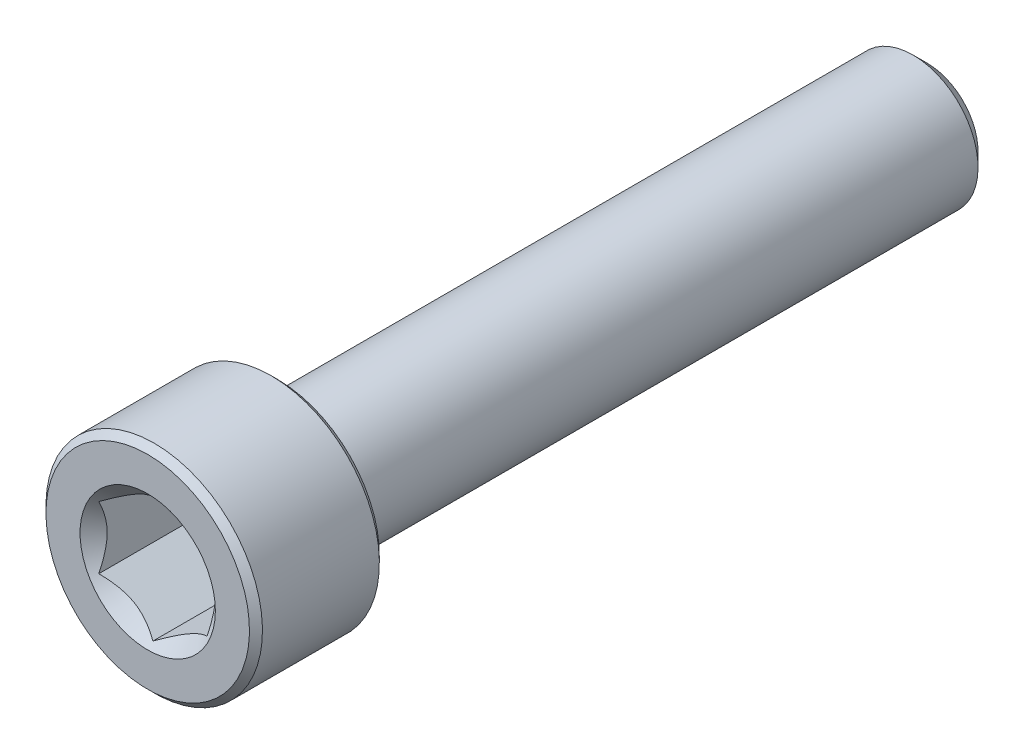
ISO-10303-21;
HEADER;
FILE_DESCRIPTION(('STEP AP214'),'2;1');
FILE_NAME('part.step','',(''),(''),'','','');
FILE_SCHEMA(('AUTOMOTIVE_DESIGN { 1 0 10303 214 1 1 1 1 }'));
ENDSEC;
DATA;
#1=APPLICATION_CONTEXT('core data for automotive mechanical design processes');
#2=APPLICATION_PROTOCOL_DEFINITION('international standard','automotive_design',2000,#1);
#3=PRODUCT_CONTEXT('',#1,'mechanical');
#4=PRODUCT('Part','Part','',(#3));
#5=PRODUCT_RELATED_PRODUCT_CATEGORY('part','',(#4));
#6=PRODUCT_DEFINITION_FORMATION('','',#4);
#7=PRODUCT_DEFINITION_CONTEXT('part definition',#1,'design');
#8=PRODUCT_DEFINITION('design','',#6,#7);
#9=PRODUCT_DEFINITION_SHAPE('','',#8);
#10=(LENGTH_UNIT() NAMED_UNIT(*) SI_UNIT(.MILLI.,.METRE.));
#11=(NAMED_UNIT(*) PLANE_ANGLE_UNIT() SI_UNIT($,.RADIAN.));
#12=(NAMED_UNIT(*) SI_UNIT($,.STERADIAN.) SOLID_ANGLE_UNIT());
#13=UNCERTAINTY_MEASURE_WITH_UNIT(LENGTH_MEASURE(1.E-05),#10,'distance_accuracy_value','');
#14=(GEOMETRIC_REPRESENTATION_CONTEXT(3) GLOBAL_UNCERTAINTY_ASSIGNED_CONTEXT((#13)) GLOBAL_UNIT_ASSIGNED_CONTEXT((#10,
#11,#12)) REPRESENTATION_CONTEXT('',''));
#15=CARTESIAN_POINT('',(0.,0.,0.));
#16=DIRECTION('',(0.,0.,1.));
#17=DIRECTION('',(1.,0.,0.));
#18=AXIS2_PLACEMENT_3D('',#15,#16,#17);
#19=CARTESIAN_POINT('',(0.,2.35048094716167,-18.));
#20=DIRECTION('',(0.,0.,-1.));
#21=DIRECTION('',(0.,1.,0.));
#22=AXIS2_PLACEMENT_3D('',#19,#20,#21);
#23=PLANE('',#22);
#24=CARTESIAN_POINT('',(0.,0.,-18.));
#25=DIRECTION('',(0.,0.,-1.));
#26=DIRECTION('',(0.,1.,0.));
#27=AXIS2_PLACEMENT_3D('',#24,#25,#26);
#28=CIRCLE('',#27,2.35048094716167);
#29=CARTESIAN_POINT('',(0.,2.35048094716167,-18.));
#30=VERTEX_POINT('',#29);
#31=EDGE_CURVE('E54',#30,#30,#28,.T.);
#32=ORIENTED_EDGE('',*,*,#31,.T.);
#33=EDGE_LOOP('',(#32));
#34=FACE_BOUND('',#33,.T.);
#35=ADVANCED_FACE('F41',(#34),#23,.T.);
#36=CARTESIAN_POINT('',(0.,0.,-18.));
#37=DIRECTION('',(0.,0.,1.));
#38=DIRECTION('',(0.,-1.,0.));
#39=AXIS2_PLACEMENT_3D('',#36,#37,#38);
#40=CONICAL_SURFACE('',#39,2.35048094716167,0.785398163397446);
#41=CARTESIAN_POINT('',(0.,0.,-17.3504809471617));
#42=DIRECTION('',(0.,0.,-1.));
#43=DIRECTION('',(0.,1.,0.));
#44=AXIS2_PLACEMENT_3D('',#41,#42,#43);
#45=CIRCLE('',#44,3.);
#46=CARTESIAN_POINT('',(0.,3.,-17.3504809471617));
#47=VERTEX_POINT('',#46);
#48=EDGE_CURVE('E157',#47,#47,#45,.T.);
#49=ORIENTED_EDGE('',*,*,#48,.T.);
#50=EDGE_LOOP('',(#49));
#51=FACE_BOUND('',#50,.T.);
#52=ORIENTED_EDGE('',*,*,#31,.F.);
#53=EDGE_LOOP('',(#52));
#54=FACE_BOUND('',#53,.T.);
#55=ADVANCED_FACE('F163',(#51,#54),#40,.T.);
#56=CARTESIAN_POINT('',(0.,0.,-18.));
#57=DIRECTION('',(0.,0.,-1.));
#58=DIRECTION('',(0.,1.,0.));
#59=AXIS2_PLACEMENT_3D('',#56,#57,#58);
#60=CYLINDRICAL_SURFACE('',#59,3.);
#61=CARTESIAN_POINT('',(0.,0.,11.7));
#62=DIRECTION('',(0.,0.,-1.));
#63=DIRECTION('',(0.,1.,0.));
#64=AXIS2_PLACEMENT_3D('',#61,#62,#63);
#65=CIRCLE('',#64,3.);
#66=CARTESIAN_POINT('',(0.,3.,11.7));
#67=VERTEX_POINT('',#66);
#68=EDGE_CURVE('E154',#67,#67,#65,.T.);
#69=ORIENTED_EDGE('',*,*,#68,.T.);
#70=EDGE_LOOP('',(#69));
#71=FACE_BOUND('',#70,.T.);
#72=ORIENTED_EDGE('',*,*,#48,.F.);
#73=EDGE_LOOP('',(#72));
#74=FACE_BOUND('',#73,.T.);
#75=ADVANCED_FACE('F165',(#71,#74),#60,.T.);
#76=CARTESIAN_POINT('',(0.,0.,11.7));
#77=DIRECTION('',(0.,0.,-1.));
#78=DIRECTION('',(0.,1.,0.));
#79=AXIS2_PLACEMENT_3D('',#76,#77,#78);
#80=TOROIDAL_SURFACE('',#79,3.3,0.3);
#81=CARTESIAN_POINT('',(0.,0.,12.));
#82=DIRECTION('',(0.,0.,-1.));
#83=DIRECTION('',(0.,1.,0.));
#84=AXIS2_PLACEMENT_3D('',#81,#82,#83);
#85=CIRCLE('',#84,3.3);
#86=CARTESIAN_POINT('',(0.,3.3,12.));
#87=VERTEX_POINT('',#86);
#88=EDGE_CURVE('E151',#87,#87,#85,.T.);
#89=ORIENTED_EDGE('',*,*,#88,.T.);
#90=EDGE_LOOP('',(#89));
#91=FACE_BOUND('',#90,.T.);
#92=ORIENTED_EDGE('',*,*,#68,.F.);
#93=EDGE_LOOP('',(#92));
#94=FACE_BOUND('',#93,.T.);
#95=ADVANCED_FACE('F171',(#91,#94),#80,.F.);
#96=CARTESIAN_POINT('',(0.,4.7,12.));
#97=DIRECTION('',(0.,0.,-1.));
#98=DIRECTION('',(0.,1.,0.));
#99=AXIS2_PLACEMENT_3D('',#96,#97,#98);
#100=PLANE('',#99);
#101=CARTESIAN_POINT('',(0.,0.,12.));
#102=DIRECTION('',(0.,0.,-1.));
#103=DIRECTION('',(0.,1.,0.));
#104=AXIS2_PLACEMENT_3D('',#101,#102,#103);
#105=CIRCLE('',#104,4.7);
#106=CARTESIAN_POINT('',(0.,4.7,12.));
#107=VERTEX_POINT('',#106);
#108=EDGE_CURVE('E148',#107,#107,#105,.T.);
#109=ORIENTED_EDGE('',*,*,#108,.T.);
#110=EDGE_LOOP('',(#109));
#111=FACE_BOUND('',#110,.T.);
#112=ORIENTED_EDGE('',*,*,#88,.F.);
#113=EDGE_LOOP('',(#112));
#114=FACE_BOUND('',#113,.T.);
#115=ADVANCED_FACE('F177',(#111,#114),#100,.T.);
#116=CARTESIAN_POINT('',(0.,0.,12.));
#117=DIRECTION('',(0.,0.,1.));
#118=DIRECTION('',(0.,-1.,0.));
#119=AXIS2_PLACEMENT_3D('',#116,#117,#118);
#120=CONICAL_SURFACE('',#119,4.7,0.785398163397445);
#121=CARTESIAN_POINT('',(0.,0.,12.3));
#122=DIRECTION('',(0.,0.,-1.));
#123=DIRECTION('',(0.,1.,0.));
#124=AXIS2_PLACEMENT_3D('',#121,#122,#123);
#125=CIRCLE('',#124,5.);
#126=CARTESIAN_POINT('',(0.,5.,12.3));
#127=VERTEX_POINT('',#126);
#128=EDGE_CURVE('E145',#127,#127,#125,.T.);
#129=ORIENTED_EDGE('',*,*,#128,.T.);
#130=EDGE_LOOP('',(#129));
#131=FACE_BOUND('',#130,.T.);
#132=ORIENTED_EDGE('',*,*,#108,.F.);
#133=EDGE_LOOP('',(#132));
#134=FACE_BOUND('',#133,.T.);
#135=ADVANCED_FACE('F181',(#131,#134),#120,.T.);
#136=CARTESIAN_POINT('',(0.,0.,-18.));
#137=DIRECTION('',(0.,0.,-1.));
#138=DIRECTION('',(0.,1.,0.));
#139=AXIS2_PLACEMENT_3D('',#136,#137,#138);
#140=CYLINDRICAL_SURFACE('',#139,5.);
#141=CARTESIAN_POINT('',(0.,0.,17.7));
#142=DIRECTION('',(0.,0.,-1.));
#143=DIRECTION('',(0.,1.,0.));
#144=AXIS2_PLACEMENT_3D('',#141,#142,#143);
#145=CIRCLE('',#144,5.);
#146=CARTESIAN_POINT('',(0.,5.,17.7));
#147=VERTEX_POINT('',#146);
#148=EDGE_CURVE('E142',#147,#147,#145,.T.);
#149=ORIENTED_EDGE('',*,*,#148,.T.);
#150=EDGE_LOOP('',(#149));
#151=FACE_BOUND('',#150,.T.);
#152=ORIENTED_EDGE('',*,*,#128,.F.);
#153=EDGE_LOOP('',(#152));
#154=FACE_BOUND('',#153,.T.);
#155=ADVANCED_FACE('F185',(#151,#154),#140,.T.);
#156=CARTESIAN_POINT('',(0.,0.,17.7));
#157=DIRECTION('',(0.,0.,-1.));
#158=DIRECTION('',(0.,1.,0.));
#159=AXIS2_PLACEMENT_3D('',#156,#157,#158);
#160=CONICAL_SURFACE('',#159,5.,0.785398163397445);
#161=CARTESIAN_POINT('',(0.,0.,18.));
#162=DIRECTION('',(0.,0.,-1.));
#163=DIRECTION('',(0.,1.,0.));
#164=AXIS2_PLACEMENT_3D('',#161,#162,#163);
#165=CIRCLE('',#164,4.7);
#166=CARTESIAN_POINT('',(0.,4.7,18.));
#167=VERTEX_POINT('',#166);
#168=EDGE_CURVE('E139',#167,#167,#165,.T.);
#169=ORIENTED_EDGE('',*,*,#168,.T.);
#170=EDGE_LOOP('',(#169));
#171=FACE_BOUND('',#170,.T.);
#172=ORIENTED_EDGE('',*,*,#148,.F.);
#173=EDGE_LOOP('',(#172));
#174=FACE_BOUND('',#173,.T.);
#175=ADVANCED_FACE('F189',(#171,#174),#160,.T.);
#176=CARTESIAN_POINT('',(0.,0.,18.));
#177=DIRECTION('',(0.,0.,1.));
#178=DIRECTION('',(0.,-1.,0.));
#179=AXIS2_PLACEMENT_3D('',#176,#177,#178);
#180=PLANE('',#179);
#181=CARTESIAN_POINT('',(0.,0.,18.));
#182=DIRECTION('',(0.,0.,1.));
#183=DIRECTION('',(1.,0.,0.));
#184=AXIS2_PLACEMENT_3D('',#181,#182,#183);
#185=CIRCLE('',#184,3.125);
#186=CARTESIAN_POINT('',(3.125,0.,18.));
#187=VERTEX_POINT('',#186);
#188=EDGE_CURVE('E113',#187,#187,#185,.T.);
#189=ORIENTED_EDGE('',*,*,#188,.F.);
#190=EDGE_LOOP('',(#189));
#191=FACE_BOUND('',#190,.T.);
#192=ORIENTED_EDGE('',*,*,#168,.F.);
#193=EDGE_LOOP('',(#192));
#194=FACE_BOUND('',#193,.T.);
#195=ADVANCED_FACE('F193',(#191,#194),#180,.T.);
#196=CARTESIAN_POINT('',(0.,0.,18.));
#197=DIRECTION('',(0.,0.,1.));
#198=DIRECTION('',(1.,0.,0.));
#199=AXIS2_PLACEMENT_3D('',#196,#197,#198);
#200=CONICAL_SURFACE('',#199,3.125,0.78539816339745);
#201=ORIENTED_EDGE('',*,*,#188,.T.);
#202=EDGE_LOOP('',(#201));
#203=FACE_BOUND('',#202,.T.);
#204=CARTESIAN_POINT('',(-0.000200000000000056,-2.88686681600197,17.7618668229299));
#205=CARTESIAN_POINT('',(0.0857382777877643,-2.83725032818751,17.7122920513029));
#206=CARTESIAN_POINT('',(0.173113567275752,-2.7868041812811,17.6656288273106));
#207=CARTESIAN_POINT('',(0.351281456165588,-2.6839389026696,17.5801894859864));
#208=CARTESIAN_POINT('',(0.442091000681074,-2.6315099876986,17.5414609083541));
#209=CARTESIAN_POINT('',(0.625204123126921,-2.52578957716234,17.4751180498459));
#210=CARTESIAN_POINT('',(0.71746106452934,-2.47252500720904,17.447337014479));
#211=CARTESIAN_POINT('',(0.904006008776285,-2.3648232334321,17.4045345218588));
#212=CARTESIAN_POINT('',(0.998288312566283,-2.31038931995913,17.3894811126195));
#213=CARTESIAN_POINT('',(1.16077825829185,-2.21657570605387,17.3758990681576));
#214=CARTESIAN_POINT('',(1.22877596788015,-2.17731721011878,17.3738884451889));
#215=CARTESIAN_POINT('',(1.36466024116922,-2.0988643883567,17.3772754631356));
#216=CARTESIAN_POINT('',(1.43254675755224,-2.05967008984862,17.382675701248));
#217=CARTESIAN_POINT('',(1.56767878823611,-1.98165157555715,17.4005771343506));
#218=CARTESIAN_POINT('',(1.63492349975356,-1.94282782326097,17.4130862729946));
#219=CARTESIAN_POINT('',(1.7682501008182,-1.86585167424616,17.4445188479038));
#220=CARTESIAN_POINT('',(1.83433207909966,-1.82769922629678,17.4634417924449));
#221=CARTESIAN_POINT('',(2.00359634669126,-1.72997445583858,17.5196187073564));
#222=CARTESIAN_POINT('',(2.10572912222289,-1.67100807039231,17.5611071775443));
#223=CARTESIAN_POINT('',(2.25590641494051,-1.58430317001562,17.6311453926712));
#224=CARTESIAN_POINT('',(2.30539653988261,-1.55573003305807,17.6557535980642));
#225=CARTESIAN_POINT('',(2.40346006383885,-1.49911303110426,17.7072132326634));
#226=CARTESIAN_POINT('',(2.45203400349693,-1.47106885396706,17.7340632847275));
#227=CARTESIAN_POINT('',(2.5002,-1.44326020292023,17.7618668229299));
#228=B_SPLINE_CURVE_WITH_KNOTS('',3,(#204,#205,#206,#207,#208,#209,#210,#211,#212,#213,#214,
#215,#216,#217,#218,#219,#220,#221,#222,#223,#224,#225,#226,#227),.UNSPECIFIED.,.F.,.F.,(4,2,2,
2,2,2,2,2,2,2,2,4),(0.,0.333012085133922,0.667964518301396,0.997597032043299,1.32639954393844,
1.56169424147169,1.79707142102083,2.03271213522171,2.26833478775651,2.64260240809533,
2.82922877818863,3.01574133749025),.UNSPECIFIED.);
#229=CARTESIAN_POINT('',(0.,-2.88675134594813,17.7617513459481));
#230=VERTEX_POINT('',#229);
#231=CARTESIAN_POINT('',(2.5,-1.44337567297406,17.7617513459481));
#232=VERTEX_POINT('',#231);
#233=EDGE_CURVE('E12',#230,#232,#228,.T.);
#234=ORIENTED_EDGE('',*,*,#233,.F.);
#235=CARTESIAN_POINT('',(-2.5002,-1.44326020292023,17.7618668229299));
#236=CARTESIAN_POINT('',(-2.41426172221224,-1.49287669073469,17.7122920513029));
#237=CARTESIAN_POINT('',(-2.32688643272425,-1.5433228376411,17.6656288273106));
#238=CARTESIAN_POINT('',(-2.14871854383441,-1.64618811625259,17.5801894859864));
#239=CARTESIAN_POINT('',(-2.05790899931892,-1.69861703122359,17.5414609083541));
#240=CARTESIAN_POINT('',(-1.87479587687308,-1.80433744175986,17.4751180498459));
#241=CARTESIAN_POINT('',(-1.78253893547066,-1.85760201171316,17.447337014479));
#242=CARTESIAN_POINT('',(-1.59599399122371,-1.96530378549009,17.4045345218588));
#243=CARTESIAN_POINT('',(-1.50171168743371,-2.01973769896307,17.3894811126195));
#244=CARTESIAN_POINT('',(-1.33922174170815,-2.11355131286833,17.3758990681576));
#245=CARTESIAN_POINT('',(-1.27122403211985,-2.15280980880341,17.3738884451889));
#246=CARTESIAN_POINT('',(-1.13533975883078,-2.23126263056549,17.3772754631356));
#247=CARTESIAN_POINT('',(-1.06745324244776,-2.27045692907358,17.382675701248));
#248=CARTESIAN_POINT('',(-0.932321211763891,-2.34847544336505,17.4005771343506));
#249=CARTESIAN_POINT('',(-0.865076500246436,-2.38729919566123,17.4130862729946));
#250=CARTESIAN_POINT('',(-0.731749899181798,-2.46427534467604,17.4445188479038));
#251=CARTESIAN_POINT('',(-0.665667920900339,-2.50242779262542,17.4634417924449));
#252=CARTESIAN_POINT('',(-0.496403653308733,-2.60015256308362,17.5196187073564));
#253=CARTESIAN_POINT('',(-0.394270877777106,-2.65911894852989,17.5611071775443));
#254=CARTESIAN_POINT('',(-0.244093585059491,-2.74582384890657,17.6311453926712));
#255=CARTESIAN_POINT('',(-0.19460346011739,-2.77439698586412,17.6557535980642));
#256=CARTESIAN_POINT('',(-0.0965399361611533,-2.83101398781794,17.7072132326634));
#257=CARTESIAN_POINT('',(-0.0479659965030722,-2.85905816495513,17.7340632847275));
#258=CARTESIAN_POINT('',(0.000199999999999496,-2.88686681600197,17.7618668229299));
#259=B_SPLINE_CURVE_WITH_KNOTS('',3,(#235,#236,#237,#238,#239,#240,#241,#242,#243,#244,#245,
#246,#247,#248,#249,#250,#251,#252,#253,#254,#255,#256,#257,#258),.UNSPECIFIED.,.F.,.F.,(4,2,2,
2,2,2,2,2,2,2,2,4),(0.,0.333012085133923,0.667964518301397,0.997597032043301,1.32639954393844,
1.56169424147169,1.79707142102083,2.03271213522171,2.26833478775651,2.64260240809533,
2.82922877818864,3.01574133749025),.UNSPECIFIED.);
#260=CARTESIAN_POINT('',(-2.5,-1.44337567297406,17.7617513459481));
#261=VERTEX_POINT('',#260);
#262=EDGE_CURVE('E99',#261,#230,#259,.T.);
#263=ORIENTED_EDGE('',*,*,#262,.F.);
#264=CARTESIAN_POINT('',(-2.5,-3.05811902614615,18.8249483513177));
#265=CARTESIAN_POINT('',(-2.5,-2.98440983945656,18.7678941624606));
#266=CARTESIAN_POINT('',(-2.5,-2.91030875691711,18.711338408655));
#267=CARTESIAN_POINT('',(-2.5,-2.76116077091499,18.5994529908989));
#268=CARTESIAN_POINT('',(-2.5,-2.68611365209695,18.5441236143263));
#269=CARTESIAN_POINT('',(-2.5,-2.53436379087041,18.4345266506783));
#270=CARTESIAN_POINT('',(-2.5,-2.45765275083383,18.3802705155369));
#271=CARTESIAN_POINT('',(-2.5,-2.30296317551963,18.2736026001631));
#272=CARTESIAN_POINT('',(-2.5,-2.22498472739569,18.2211906938896));
#273=CARTESIAN_POINT('',(-2.5,-2.06236769759978,18.115263211588));
#274=CARTESIAN_POINT('',(-2.5,-1.97762830350827,18.0619016261172));
#275=CARTESIAN_POINT('',(-2.5,-1.80618229870077,17.9584430751365));
#276=CARTESIAN_POINT('',(-2.5,-1.71947594494662,17.9083456864684));
#277=CARTESIAN_POINT('',(-2.5,-1.54402392194024,17.8124525300635));
#278=CARTESIAN_POINT('',(-2.5,-1.45528486870173,17.7666447518847));
#279=CARTESIAN_POINT('',(-2.5,-1.27526975606122,17.6803657409276));
#280=CARTESIAN_POINT('',(-2.5,-1.18399493457035,17.6398919577617));
#281=CARTESIAN_POINT('',(-2.5,-1.00836471270812,17.5696282555703));
#282=CARTESIAN_POINT('',(-2.5,-0.924281821785677,17.5391640684491));
#283=CARTESIAN_POINT('',(-2.5,-0.75393460397013,17.4849624341985));
#284=CARTESIAN_POINT('',(-2.5,-0.667670141814685,17.4612254052873));
#285=CARTESIAN_POINT('',(-2.5,-0.495001348242843,17.4221752112613));
#286=CARTESIAN_POINT('',(-2.5,-0.408632911050735,17.406706028656));
#287=CARTESIAN_POINT('',(-2.5,-0.234772754668961,17.3845210883891));
#288=CARTESIAN_POINT('',(-2.5,-0.147281287804297,17.3778033980202));
#289=CARTESIAN_POINT('',(-2.5,0.0238518936773421,17.3737182218653));
#290=CARTESIAN_POINT('',(-2.5,0.107483635135719,17.3759308676149));
#291=CARTESIAN_POINT('',(-2.5,0.274114195685811,17.3886096800111));
#292=CARTESIAN_POINT('',(-2.5,0.357112958145577,17.3990765766091));
#293=CARTESIAN_POINT('',(-2.5,0.523288144897413,17.4278421327409));
#294=CARTESIAN_POINT('',(-2.5,0.606439950061683,17.4462808031454));
#295=CARTESIAN_POINT('',(-2.5,0.770896010035102,17.489956208676));
#296=CARTESIAN_POINT('',(-2.5,0.852200351882827,17.5151926228204));
#297=CARTESIAN_POINT('',(-2.5,1.10064624940811,17.6020006776711));
#298=CARTESIAN_POINT('',(-2.5,1.26445670942464,17.6731337561378));
#299=CARTESIAN_POINT('',(-2.5,1.50421272270141,17.7918201200772));
#300=CARTESIAN_POINT('',(-2.5,1.58328419057904,17.833471615305));
#301=CARTESIAN_POINT('',(-2.5,1.73963927584191,17.9200124035774));
#302=CARTESIAN_POINT('',(-2.5,1.81692320237101,17.9649011311494));
#303=CARTESIAN_POINT('',(-2.5,1.96613896389381,18.0549912173065));
#304=CARTESIAN_POINT('',(-2.5,2.03814682362153,18.1000680708391));
#305=CARTESIAN_POINT('',(-2.5,2.18092679643221,18.1921473192976));
#306=CARTESIAN_POINT('',(-2.5,2.25169881661101,18.2391498581055));
#307=CARTESIAN_POINT('',(-2.5,2.39159945333183,18.3343550134732));
#308=CARTESIAN_POINT('',(-2.5,2.46073668867174,18.3825450175112));
#309=CARTESIAN_POINT('',(-2.5,2.59806183277128,18.4802211436377));
#310=CARTESIAN_POINT('',(-2.5,2.66624999804919,18.5297069046595));
#311=CARTESIAN_POINT('',(-2.5,2.73404006469874,18.5797233466722));
#312=B_SPLINE_CURVE_WITH_KNOTS('',3,(#264,#265,#266,#267,#268,#269,#270,#271,#272,#273,#274,
#275,#276,#277,#278,#279,#280,#281,#282,#283,#284,#285,#286,#287,#288,#289,#290,#291,#292,#293,
#294,#295,#296,#297,#298,#299,#300,#301,#302,#303,#304,#305,#306,#307,#308,#309,#310,#311),
.UNSPECIFIED.,.F.,.F.,(4,2,2,2,2,2,2,2,2,2,2,2,2,2,2,2,2,2,2,2,2,2,2,4),(0.,0.279636937737097,
0.559338724655693,0.841193583356597,1.12302914154391,1.42339426279004,1.72372036804099,
2.02317874224782,2.32249341038693,2.59055815083283,2.85863955284489,3.12146553699265,
3.38423346797086,3.6347944563997,3.88537760527732,4.14055298164195,4.39571631103123,
4.92983151325628,5.19792074748275,5.46596326536873,5.72079181091925,5.9756394314289,
6.22844778309936,6.48118642327295),.UNSPECIFIED.);
#313=CARTESIAN_POINT('',(-2.5,1.44337567297406,17.7617513459481));
#314=VERTEX_POINT('',#313);
#315=EDGE_CURVE('E112',#314,#261,#312,.F.);
#316=ORIENTED_EDGE('',*,*,#315,.F.);
#317=CARTESIAN_POINT('',(0.000199999999999799,2.88686681600197,17.7618668229299));
#318=CARTESIAN_POINT('',(-0.0857382777877651,2.83725032818751,17.7122920513029));
#319=CARTESIAN_POINT('',(-0.173113567275754,2.7868041812811,17.6656288273106));
#320=CARTESIAN_POINT('',(-0.351281456165589,2.6839389026696,17.5801894859864));
#321=CARTESIAN_POINT('',(-0.442091000681075,2.6315099876986,17.5414609083541));
#322=CARTESIAN_POINT('',(-0.625204123126922,2.52578957716234,17.4751180498459));
#323=CARTESIAN_POINT('',(-0.717461064529342,2.47252500720904,17.447337014479));
#324=CARTESIAN_POINT('',(-0.904006008776287,2.3648232334321,17.4045345218588));
#325=CARTESIAN_POINT('',(-0.998288312566284,2.31038931995913,17.3894811126195));
#326=CARTESIAN_POINT('',(-1.16077825829185,2.21657570605387,17.3758990681576));
#327=CARTESIAN_POINT('',(-1.22877596788015,2.17731721011878,17.3738884451889));
#328=CARTESIAN_POINT('',(-1.36466024116922,2.0988643883567,17.3772754631356));
#329=CARTESIAN_POINT('',(-1.43254675755224,2.05967008984862,17.3826757012479));
#330=CARTESIAN_POINT('',(-1.56767878823611,1.98165157555715,17.4005771343506));
#331=CARTESIAN_POINT('',(-1.63492349975356,1.94282782326096,17.4130862729946));
#332=CARTESIAN_POINT('',(-1.7682501008182,1.86585167424616,17.4445188479038));
#333=CARTESIAN_POINT('',(-1.83433207909966,1.82769922629677,17.4634417924449));
#334=CARTESIAN_POINT('',(-2.00359634669127,1.72997445583858,17.5196187073564));
#335=CARTESIAN_POINT('',(-2.10572912222289,1.67100807039231,17.5611071775443));
#336=CARTESIAN_POINT('',(-2.25590641494051,1.58430317001562,17.6311453926712));
#337=CARTESIAN_POINT('',(-2.30539653988261,1.55573003305807,17.6557535980642));
#338=CARTESIAN_POINT('',(-2.40346006383885,1.49911303110426,17.7072132326634));
#339=CARTESIAN_POINT('',(-2.45203400349693,1.47106885396706,17.7340632847275));
#340=CARTESIAN_POINT('',(-2.5002,1.44326020292023,17.7618668229299));
#341=B_SPLINE_CURVE_WITH_KNOTS('',3,(#317,#318,#319,#320,#321,#322,#323,#324,#325,#326,#327,
#328,#329,#330,#331,#332,#333,#334,#335,#336,#337,#338,#339,#340),.UNSPECIFIED.,.F.,.F.,(4,2,2,
2,2,2,2,2,2,2,2,4),(0.,0.333012085133925,0.667964518301399,0.997597032043301,1.32639954393844,
1.56169424147169,1.79707142102083,2.03271213522171,2.26833478775651,2.64260240809533,
2.82922877818864,3.01574133749025),.UNSPECIFIED.);
#342=CARTESIAN_POINT('',(0.,2.88675134594813,17.7617513459481));
#343=VERTEX_POINT('',#342);
#344=EDGE_CURVE('E243',#343,#314,#341,.T.);
#345=ORIENTED_EDGE('',*,*,#344,.F.);
#346=CARTESIAN_POINT('',(2.5002,1.44326020292023,17.7618668229299));
#347=CARTESIAN_POINT('',(2.41426172221224,1.49287669073468,17.7122920513029));
#348=CARTESIAN_POINT('',(2.32688643272425,1.5433228376411,17.6656288273106));
#349=CARTESIAN_POINT('',(2.14871854383441,1.64618811625259,17.5801894859864));
#350=CARTESIAN_POINT('',(2.05790899931892,1.69861703122359,17.5414609083541));
#351=CARTESIAN_POINT('',(1.87479587687308,1.80433744175986,17.4751180498459));
#352=CARTESIAN_POINT('',(1.78253893547066,1.85760201171316,17.447337014479));
#353=CARTESIAN_POINT('',(1.59599399122371,1.96530378549009,17.4045345218588));
#354=CARTESIAN_POINT('',(1.50171168743371,2.01973769896307,17.3894811126195));
#355=CARTESIAN_POINT('',(1.33922174170815,2.11355131286833,17.3758990681576));
#356=CARTESIAN_POINT('',(1.27122403211985,2.15280980880341,17.3738884451889));
#357=CARTESIAN_POINT('',(1.13533975883078,2.23126263056549,17.3772754631356));
#358=CARTESIAN_POINT('',(1.06745324244776,2.27045692907358,17.3826757012479));
#359=CARTESIAN_POINT('',(0.93232121176389,2.34847544336505,17.4005771343506));
#360=CARTESIAN_POINT('',(0.865076500246436,2.38729919566123,17.4130862729946));
#361=CARTESIAN_POINT('',(0.731749899181797,2.46427534467604,17.4445188479038));
#362=CARTESIAN_POINT('',(0.665667920900339,2.50242779262542,17.4634417924449));
#363=CARTESIAN_POINT('',(0.496403653308732,2.60015256308362,17.5196187073564));
#364=CARTESIAN_POINT('',(0.394270877777105,2.65911894852989,17.5611071775443));
#365=CARTESIAN_POINT('',(0.244093585059489,2.74582384890657,17.6311453926712));
#366=CARTESIAN_POINT('',(0.194603460117389,2.77439698586412,17.6557535980642));
#367=CARTESIAN_POINT('',(0.0965399361611518,2.83101398781794,17.7072132326634));
#368=CARTESIAN_POINT('',(0.0479659965030707,2.85905816495513,17.7340632847275));
#369=CARTESIAN_POINT('',(-0.000200000000000767,2.88686681600197,17.7618668229299));
#370=B_SPLINE_CURVE_WITH_KNOTS('',3,(#346,#347,#348,#349,#350,#351,#352,#353,#354,#355,#356,
#357,#358,#359,#360,#361,#362,#363,#364,#365,#366,#367,#368,#369),.UNSPECIFIED.,.F.,.F.,(4,2,2,
2,2,2,2,2,2,2,2,4),(0.,0.333012085133926,0.6679645183014,0.997597032043304,1.32639954393845,
1.56169424147169,1.79707142102083,2.03271213522171,2.26833478775651,2.64260240809533,
2.82922877818864,3.01574133749025),.UNSPECIFIED.);
#371=CARTESIAN_POINT('',(2.5,1.44337567297406,17.7617513459481));
#372=VERTEX_POINT('',#371);
#373=EDGE_CURVE('E216',#372,#343,#370,.T.);
#374=ORIENTED_EDGE('',*,*,#373,.F.);
#375=CARTESIAN_POINT('',(2.5,-3.05811902614615,18.8249483513177));
#376=CARTESIAN_POINT('',(2.5,-2.98440983945656,18.7678941624606));
#377=CARTESIAN_POINT('',(2.5,-2.91030875691711,18.711338408655));
#378=CARTESIAN_POINT('',(2.5,-2.76116077091499,18.5994529908989));
#379=CARTESIAN_POINT('',(2.5,-2.68611365209695,18.5441236143263));
#380=CARTESIAN_POINT('',(2.5,-2.53436379087041,18.4345266506783));
#381=CARTESIAN_POINT('',(2.5,-2.45765275083383,18.3802705155369));
#382=CARTESIAN_POINT('',(2.5,-2.30296317551963,18.2736026001631));
#383=CARTESIAN_POINT('',(2.5,-2.22498472739569,18.2211906938896));
#384=CARTESIAN_POINT('',(2.5,-2.06236769759978,18.115263211588));
#385=CARTESIAN_POINT('',(2.5,-1.97762830350827,18.0619016261172));
#386=CARTESIAN_POINT('',(2.5,-1.80618229870077,17.9584430751365));
#387=CARTESIAN_POINT('',(2.5,-1.71947594494662,17.9083456864684));
#388=CARTESIAN_POINT('',(2.5,-1.54402392194024,17.8124525300635));
#389=CARTESIAN_POINT('',(2.5,-1.45528486870173,17.7666447518847));
#390=CARTESIAN_POINT('',(2.5,-1.27526975606122,17.6803657409276));
#391=CARTESIAN_POINT('',(2.5,-1.18399493457035,17.6398919577617));
#392=CARTESIAN_POINT('',(2.5,-1.00836471270812,17.5696282555703));
#393=CARTESIAN_POINT('',(2.5,-0.924281821785676,17.5391640684491));
#394=CARTESIAN_POINT('',(2.5,-0.753934603970129,17.4849624341985));
#395=CARTESIAN_POINT('',(2.5,-0.667670141814684,17.4612254052873));
#396=CARTESIAN_POINT('',(2.5,-0.495001348242841,17.4221752112613));
#397=CARTESIAN_POINT('',(2.5,-0.408632911050733,17.406706028656));
#398=CARTESIAN_POINT('',(2.5,-0.234772754668958,17.3845210883891));
#399=CARTESIAN_POINT('',(2.5,-0.147281287804294,17.3778033980202));
#400=CARTESIAN_POINT('',(2.5,0.0238518936773452,17.3737182218653));
#401=CARTESIAN_POINT('',(2.5,0.107483635135722,17.3759308676149));
#402=CARTESIAN_POINT('',(2.5,0.274114195685814,17.3886096800111));
#403=CARTESIAN_POINT('',(2.5,0.357112958145579,17.3990765766091));
#404=CARTESIAN_POINT('',(2.5,0.523288144897416,17.4278421327409));
#405=CARTESIAN_POINT('',(2.5,0.606439950061687,17.4462808031454));
#406=CARTESIAN_POINT('',(2.5,0.770896010035105,17.489956208676));
#407=CARTESIAN_POINT('',(2.5,0.852200351882828,17.5151926228204));
#408=CARTESIAN_POINT('',(2.5,1.10064624940811,17.6020006776711));
#409=CARTESIAN_POINT('',(2.5,1.26445670942465,17.6731337561378));
#410=CARTESIAN_POINT('',(2.5,1.50421272270141,17.7918201200772));
#411=CARTESIAN_POINT('',(2.5,1.58328419057904,17.833471615305));
#412=CARTESIAN_POINT('',(2.5,1.73963927584191,17.9200124035774));
#413=CARTESIAN_POINT('',(2.5,1.81692320237102,17.9649011311494));
#414=CARTESIAN_POINT('',(2.5,1.96613896389381,18.0549912173065));
#415=CARTESIAN_POINT('',(2.5,2.03814682362153,18.1000680708391));
#416=CARTESIAN_POINT('',(2.5,2.18092679643222,18.1921473192976));
#417=CARTESIAN_POINT('',(2.5,2.25169881661102,18.2391498581055));
#418=CARTESIAN_POINT('',(2.5,2.39159945333183,18.3343550134732));
#419=CARTESIAN_POINT('',(2.5,2.46073668867174,18.3825450175112));
#420=CARTESIAN_POINT('',(2.5,2.59806183277128,18.4802211436377));
#421=CARTESIAN_POINT('',(2.5,2.66624999804919,18.5297069046595));
#422=CARTESIAN_POINT('',(2.5,2.73404006469875,18.5797233466722));
#423=B_SPLINE_CURVE_WITH_KNOTS('',3,(#375,#376,#377,#378,#379,#380,#381,#382,#383,#384,#385,
#386,#387,#388,#389,#390,#391,#392,#393,#394,#395,#396,#397,#398,#399,#400,#401,#402,#403,#404,
#405,#406,#407,#408,#409,#410,#411,#412,#413,#414,#415,#416,#417,#418,#419,#420,#421,#422),
.UNSPECIFIED.,.F.,.F.,(4,2,2,2,2,2,2,2,2,2,2,2,2,2,2,2,2,2,2,2,2,2,2,4),(0.,0.279636937737097,
0.559338724655693,0.841193583356598,1.12302914154391,1.42339426279004,1.72372036804099,
2.02317874224783,2.32249341038693,2.59055815083283,2.85863955284489,3.12146553699265,
3.38423346797087,3.6347944563997,3.88537760527732,4.14055298164195,4.39571631103123,
4.92983151325628,5.19792074748275,5.46596326536874,5.72079181091925,5.9756394314289,
6.22844778309936,6.48118642327295),.UNSPECIFIED.);
#424=EDGE_CURVE('E61',#232,#372,#423,.T.);
#425=ORIENTED_EDGE('',*,*,#424,.F.);
#426=EDGE_LOOP('',(#234,#263,#316,#345,#374,#425));
#427=FACE_BOUND('',#426,.T.);
#428=ADVANCED_FACE('F98',(#203,#427),#200,.F.);
#429=CARTESIAN_POINT('',(0.,4.7,13.));
#430=DIRECTION('',(0.,0.,-1.));
#431=DIRECTION('',(0.,1.,0.));
#432=AXIS2_PLACEMENT_3D('',#429,#430,#431);
#433=PLANE('',#432);
#434=DIRECTION('',(0.866025403784439,0.5,0.));
#435=VECTOR('',#434,1.);
#436=CARTESIAN_POINT('',(0.,-2.88675134594813,13.));
#437=LINE('',#436,#435);
#438=CARTESIAN_POINT('',(0.,-2.88675134594813,13.));
#439=VERTEX_POINT('',#438);
#440=CARTESIAN_POINT('',(2.5,-1.44337567297406,13.));
#441=VERTEX_POINT('',#440);
#442=EDGE_CURVE('E116',#439,#441,#437,.T.);
#443=ORIENTED_EDGE('',*,*,#442,.T.);
#444=DIRECTION('',(0.,1.,0.));
#445=VECTOR('',#444,1.);
#446=CARTESIAN_POINT('',(2.5,-1.44337567297406,13.));
#447=LINE('',#446,#445);
#448=CARTESIAN_POINT('',(2.5,1.44337567297406,13.));
#449=VERTEX_POINT('',#448);
#450=EDGE_CURVE('E68',#441,#449,#447,.T.);
#451=ORIENTED_EDGE('',*,*,#450,.T.);
#452=DIRECTION('',(-0.866025403784439,0.5,0.));
#453=VECTOR('',#452,1.);
#454=CARTESIAN_POINT('',(2.5,1.44337567297406,13.));
#455=LINE('',#454,#453);
#456=CARTESIAN_POINT('',(0.,2.88675134594813,13.));
#457=VERTEX_POINT('',#456);
#458=EDGE_CURVE('E124',#449,#457,#455,.T.);
#459=ORIENTED_EDGE('',*,*,#458,.T.);
#460=DIRECTION('',(-0.866025403784439,-0.5,0.));
#461=VECTOR('',#460,1.);
#462=CARTESIAN_POINT('',(0.,2.88675134594813,13.));
#463=LINE('',#462,#461);
#464=CARTESIAN_POINT('',(-2.5,1.44337567297406,13.));
#465=VERTEX_POINT('',#464);
#466=EDGE_CURVE('E131',#457,#465,#463,.T.);
#467=ORIENTED_EDGE('',*,*,#466,.T.);
#468=DIRECTION('',(0.,-1.,0.));
#469=VECTOR('',#468,1.);
#470=CARTESIAN_POINT('',(-2.5,1.44337567297406,13.));
#471=LINE('',#470,#469);
#472=CARTESIAN_POINT('',(-2.5,-1.44337567297406,13.));
#473=VERTEX_POINT('',#472);
#474=EDGE_CURVE('E127',#465,#473,#471,.T.);
#475=ORIENTED_EDGE('',*,*,#474,.T.);
#476=DIRECTION('',(0.866025403784439,-0.5,0.));
#477=VECTOR('',#476,1.);
#478=CARTESIAN_POINT('',(-2.5,-1.44337567297406,13.));
#479=LINE('',#478,#477);
#480=EDGE_CURVE('E117',#473,#439,#479,.T.);
#481=ORIENTED_EDGE('',*,*,#480,.T.);
#482=EDGE_LOOP('',(#443,#451,#459,#467,#475,#481));
#483=FACE_BOUND('',#482,.T.);
#484=ADVANCED_FACE('F198',(#483),#433,.F.);
#485=CARTESIAN_POINT('',(0.,-2.88675134594813,4.36237384174027));
#486=DIRECTION('',(0.5,-0.866025403784439,0.));
#487=DIRECTION('',(0.866025403784439,0.5,0.));
#488=AXIS2_PLACEMENT_3D('',#485,#486,#487);
#489=PLANE('',#488);
#490=DIRECTION('',(0.,0.,1.));
#491=VECTOR('',#490,1.);
#492=CARTESIAN_POINT('',(0.,-2.88675134594813,4.36237384174027));
#493=LINE('',#492,#491);
#494=EDGE_CURVE('E108',#439,#230,#493,.T.);
#495=ORIENTED_EDGE('',*,*,#494,.T.);
#496=ORIENTED_EDGE('',*,*,#233,.T.);
#497=DIRECTION('',(0.,0.,1.));
#498=VECTOR('',#497,1.);
#499=CARTESIAN_POINT('',(2.5,-1.44337567297406,4.36237384174027));
#500=LINE('',#499,#498);
#501=EDGE_CURVE('E119',#441,#232,#500,.T.);
#502=ORIENTED_EDGE('',*,*,#501,.F.);
#503=ORIENTED_EDGE('',*,*,#442,.F.);
#504=EDGE_LOOP('',(#495,#496,#502,#503));
#505=FACE_BOUND('',#504,.T.);
#506=ADVANCED_FACE('F115',(#505),#489,.F.);
#507=CARTESIAN_POINT('',(-2.5,-1.44337567297406,4.36237384174027));
#508=DIRECTION('',(-0.5,-0.866025403784439,0.));
#509=DIRECTION('',(0.866025403784439,-0.5,0.));
#510=AXIS2_PLACEMENT_3D('',#507,#508,#509);
#511=PLANE('',#510);
#512=DIRECTION('',(0.,0.,1.));
#513=VECTOR('',#512,1.);
#514=CARTESIAN_POINT('',(-2.5,-1.44337567297406,4.36237384174027));
#515=LINE('',#514,#513);
#516=EDGE_CURVE('E111',#473,#261,#515,.T.);
#517=ORIENTED_EDGE('',*,*,#516,.T.);
#518=ORIENTED_EDGE('',*,*,#262,.T.);
#519=ORIENTED_EDGE('',*,*,#494,.F.);
#520=ORIENTED_EDGE('',*,*,#480,.F.);
#521=EDGE_LOOP('',(#517,#518,#519,#520));
#522=FACE_BOUND('',#521,.T.);
#523=ADVANCED_FACE('F107',(#522),#511,.F.);
#524=CARTESIAN_POINT('',(-2.5,1.44337567297406,4.36237384174027));
#525=DIRECTION('',(-1.,0.,0.));
#526=DIRECTION('',(0.,0.,1.));
#527=AXIS2_PLACEMENT_3D('',#524,#525,#526);
#528=PLANE('',#527);
#529=DIRECTION('',(0.,0.,1.));
#530=VECTOR('',#529,1.);
#531=CARTESIAN_POINT('',(-2.5,1.44337567297406,4.36237384174027));
#532=LINE('',#531,#530);
#533=EDGE_CURVE('E128',#465,#314,#532,.T.);
#534=ORIENTED_EDGE('',*,*,#533,.T.);
#535=ORIENTED_EDGE('',*,*,#315,.T.);
#536=ORIENTED_EDGE('',*,*,#516,.F.);
#537=ORIENTED_EDGE('',*,*,#474,.F.);
#538=EDGE_LOOP('',(#534,#535,#536,#537));
#539=FACE_BOUND('',#538,.T.);
#540=ADVANCED_FACE('F252',(#539),#528,.F.);
#541=CARTESIAN_POINT('',(0.,2.88675134594813,4.36237384174027));
#542=DIRECTION('',(-0.5,0.866025403784439,0.));
#543=DIRECTION('',(-0.866025403784439,-0.5,0.));
#544=AXIS2_PLACEMENT_3D('',#541,#542,#543);
#545=PLANE('',#544);
#546=DIRECTION('',(0.,0.,1.));
#547=VECTOR('',#546,1.);
#548=CARTESIAN_POINT('',(0.,2.88675134594813,4.36237384174027));
#549=LINE('',#548,#547);
#550=EDGE_CURVE('E132',#457,#343,#549,.T.);
#551=ORIENTED_EDGE('',*,*,#550,.T.);
#552=ORIENTED_EDGE('',*,*,#344,.T.);
#553=ORIENTED_EDGE('',*,*,#533,.F.);
#554=ORIENTED_EDGE('',*,*,#466,.F.);
#555=EDGE_LOOP('',(#551,#552,#553,#554));
#556=FACE_BOUND('',#555,.T.);
#557=ADVANCED_FACE('F249',(#556),#545,.F.);
#558=CARTESIAN_POINT('',(2.5,1.44337567297406,4.36237384174027));
#559=DIRECTION('',(0.5,0.866025403784439,0.));
#560=DIRECTION('',(-0.866025403784439,0.5,0.));
#561=AXIS2_PLACEMENT_3D('',#558,#559,#560);
#562=PLANE('',#561);
#563=DIRECTION('',(0.,0.,1.));
#564=VECTOR('',#563,1.);
#565=CARTESIAN_POINT('',(2.5,1.44337567297406,4.36237384174027));
#566=LINE('',#565,#564);
#567=EDGE_CURVE('E135',#449,#372,#566,.T.);
#568=ORIENTED_EDGE('',*,*,#567,.T.);
#569=ORIENTED_EDGE('',*,*,#373,.T.);
#570=ORIENTED_EDGE('',*,*,#550,.F.);
#571=ORIENTED_EDGE('',*,*,#458,.F.);
#572=EDGE_LOOP('',(#568,#569,#570,#571));
#573=FACE_BOUND('',#572,.T.);
#574=ADVANCED_FACE('F206',(#573),#562,.F.);
#575=CARTESIAN_POINT('',(2.5,-1.44337567297406,4.36237384174027));
#576=DIRECTION('',(1.,0.,0.));
#577=DIRECTION('',(0.,0.,-1.));
#578=AXIS2_PLACEMENT_3D('',#575,#576,#577);
#579=PLANE('',#578);
#580=ORIENTED_EDGE('',*,*,#501,.T.);
#581=ORIENTED_EDGE('',*,*,#424,.T.);
#582=ORIENTED_EDGE('',*,*,#567,.F.);
#583=ORIENTED_EDGE('',*,*,#450,.F.);
#584=EDGE_LOOP('',(#580,#581,#582,#583));
#585=FACE_BOUND('',#584,.T.);
#586=ADVANCED_FACE('F202',(#585),#579,.F.);
#587=CLOSED_SHELL('',(#35,#55,#75,#95,#115,#135,#155,#175,#195,#428,#484,#506,#523,#540,#557,
#574,#586));
#588=MANIFOLD_SOLID_BREP('B2',#587);
#589=ADVANCED_BREP_SHAPE_REPRESENTATION('',(#18,#588),#14);
#590=SHAPE_DEFINITION_REPRESENTATION(#9,#589);
ENDSEC;
END-ISO-10303-21;
